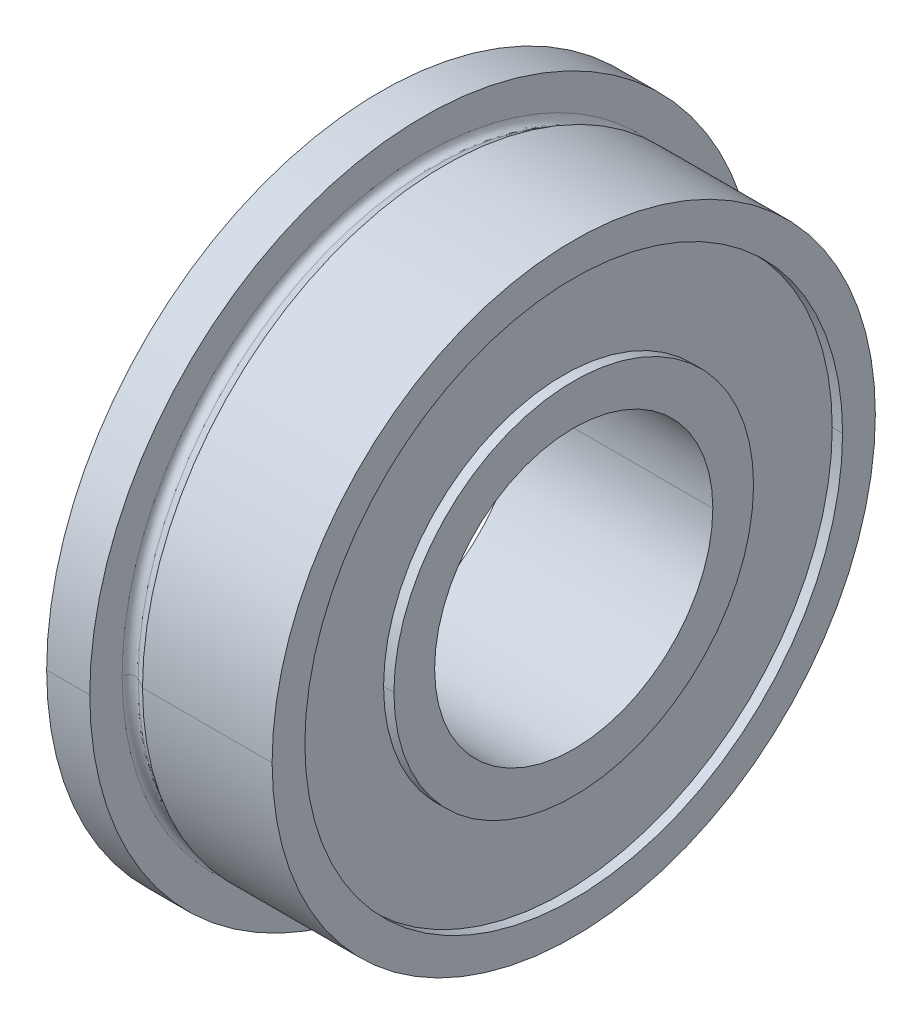
ISO-10303-21;
HEADER;
FILE_DESCRIPTION(('STEP AP214'),'2;1');
FILE_NAME('part.step','',(''),(''),'','','');
FILE_SCHEMA(('AUTOMOTIVE_DESIGN { 1 0 10303 214 1 1 1 1 }'));
ENDSEC;
DATA;
#1=APPLICATION_CONTEXT('core data for automotive mechanical design processes');
#2=APPLICATION_PROTOCOL_DEFINITION('international standard','automotive_design',2000,#1);
#3=PRODUCT_CONTEXT('',#1,'mechanical');
#4=PRODUCT('Part','Part','',(#3));
#5=PRODUCT_RELATED_PRODUCT_CATEGORY('part','',(#4));
#6=PRODUCT_DEFINITION_FORMATION('','',#4);
#7=PRODUCT_DEFINITION_CONTEXT('part definition',#1,'design');
#8=PRODUCT_DEFINITION('design','',#6,#7);
#9=PRODUCT_DEFINITION_SHAPE('','',#8);
#10=(LENGTH_UNIT() NAMED_UNIT(*) SI_UNIT(.MILLI.,.METRE.));
#11=(NAMED_UNIT(*) PLANE_ANGLE_UNIT() SI_UNIT($,.RADIAN.));
#12=(NAMED_UNIT(*) SI_UNIT($,.STERADIAN.) SOLID_ANGLE_UNIT());
#13=UNCERTAINTY_MEASURE_WITH_UNIT(LENGTH_MEASURE(1.E-05),#10,'distance_accuracy_value','');
#14=(GEOMETRIC_REPRESENTATION_CONTEXT(3) GLOBAL_UNCERTAINTY_ASSIGNED_CONTEXT((#13)) GLOBAL_UNIT_ASSIGNED_CONTEXT((#10,
#11,#12)) REPRESENTATION_CONTEXT('',''));
#15=CARTESIAN_POINT('',(0.,0.,0.));
#16=DIRECTION('',(0.,0.,1.));
#17=DIRECTION('',(1.,0.,0.));
#18=AXIS2_PLACEMENT_3D('',#15,#16,#17);
#19=CARTESIAN_POINT('',(7.112,9.906,0.));
#20=DIRECTION('',(-1.,0.,0.));
#21=DIRECTION('',(0.,0.,1.));
#22=AXIS2_PLACEMENT_3D('',#19,#20,#21);
#23=PLANE('',#22);
#24=CARTESIAN_POINT('',(7.112,0.,0.));
#25=DIRECTION('',(-1.,0.,0.));
#26=DIRECTION('',(0.,0.,1.));
#27=AXIS2_PLACEMENT_3D('',#24,#25,#26);
#28=CIRCLE('',#27,9.906);
#29=CARTESIAN_POINT('',(7.112,0.,9.906));
#30=VERTEX_POINT('',#29);
#31=CARTESIAN_POINT('',(7.112,0.,-9.906));
#32=VERTEX_POINT('',#31);
#33=EDGE_CURVE('E29',#30,#32,#28,.T.);
#34=ORIENTED_EDGE('',*,*,#33,.T.);
#35=CARTESIAN_POINT('',(7.112,0.,0.));
#36=DIRECTION('',(-1.,0.,0.));
#37=DIRECTION('',(0.,0.,1.));
#38=AXIS2_PLACEMENT_3D('',#35,#36,#37);
#39=CIRCLE('',#38,9.906);
#40=EDGE_CURVE('E248',#32,#30,#39,.T.);
#41=ORIENTED_EDGE('',*,*,#40,.T.);
#42=EDGE_LOOP('',(#34,#41));
#43=FACE_BOUND('',#42,.T.);
#44=CARTESIAN_POINT('',(7.112,0.,0.));
#45=DIRECTION('',(-1.,0.,0.));
#46=DIRECTION('',(0.,0.,1.));
#47=AXIS2_PLACEMENT_3D('',#44,#45,#46);
#48=CIRCLE('',#47,11.1125);
#49=CARTESIAN_POINT('',(7.112,0.,11.1125));
#50=VERTEX_POINT('',#49);
#51=CARTESIAN_POINT('',(7.112,0.,-11.1125));
#52=VERTEX_POINT('',#51);
#53=EDGE_CURVE('E312',#50,#52,#48,.T.);
#54=ORIENTED_EDGE('',*,*,#53,.F.);
#55=CARTESIAN_POINT('',(7.112,0.,0.));
#56=DIRECTION('',(-1.,0.,0.));
#57=DIRECTION('',(0.,0.,1.));
#58=AXIS2_PLACEMENT_3D('',#55,#56,#57);
#59=CIRCLE('',#58,11.1125);
#60=EDGE_CURVE('E10',#52,#50,#59,.T.);
#61=ORIENTED_EDGE('',*,*,#60,.F.);
#62=EDGE_LOOP('',(#54,#61));
#63=FACE_BOUND('',#62,.T.);
#64=ADVANCED_FACE('F16',(#43,#63),#23,.F.);
#65=CARTESIAN_POINT('',(0.,0.,0.));
#66=DIRECTION('',(-1.,0.,0.));
#67=DIRECTION('',(0.,0.,1.));
#68=AXIS2_PLACEMENT_3D('',#65,#66,#67);
#69=CYLINDRICAL_SURFACE('',#68,11.1125);
#70=DIRECTION('',(-1.,0.,0.));
#71=VECTOR('',#70,1.);
#72=CARTESIAN_POINT('',(0.,0.,-11.1125));
#73=LINE('',#72,#71);
#74=CARTESIAN_POINT('',(2.3375,0.,-11.1125));
#75=VERTEX_POINT('',#74);
#76=EDGE_CURVE('E219',#52,#75,#73,.T.);
#77=ORIENTED_EDGE('',*,*,#76,.F.);
#78=ORIENTED_EDGE('',*,*,#60,.T.);
#79=DIRECTION('',(-1.,0.,0.));
#80=VECTOR('',#79,1.);
#81=CARTESIAN_POINT('',(0.,0.,11.1125));
#82=LINE('',#81,#80);
#83=CARTESIAN_POINT('',(2.3375,0.,11.1125));
#84=VERTEX_POINT('',#83);
#85=EDGE_CURVE('E213',#50,#84,#82,.T.);
#86=ORIENTED_EDGE('',*,*,#85,.T.);
#87=CARTESIAN_POINT('',(2.3375,0.,0.));
#88=DIRECTION('',(-1.,0.,0.));
#89=DIRECTION('',(0.,0.,-1.));
#90=AXIS2_PLACEMENT_3D('',#87,#88,#89);
#91=CIRCLE('',#90,11.1125);
#92=EDGE_CURVE('E197',#75,#84,#91,.T.);
#93=ORIENTED_EDGE('',*,*,#92,.F.);
#94=EDGE_LOOP('',(#77,#78,#86,#93));
#95=FACE_BOUND('',#94,.T.);
#96=ADVANCED_FACE('F215',(#95),#69,.T.);
#97=CARTESIAN_POINT('',(0.,0.,0.));
#98=DIRECTION('',(-1.,0.,0.));
#99=DIRECTION('',(0.,0.,1.));
#100=AXIS2_PLACEMENT_3D('',#97,#98,#99);
#101=CYLINDRICAL_SURFACE('',#100,9.906);
#102=DIRECTION('',(-1.,0.,0.));
#103=VECTOR('',#102,1.);
#104=CARTESIAN_POINT('',(0.,0.,-9.906));
#105=LINE('',#104,#103);
#106=CARTESIAN_POINT('',(6.731,0.,-9.906));
#107=VERTEX_POINT('',#106);
#108=EDGE_CURVE('E252',#32,#107,#105,.T.);
#109=ORIENTED_EDGE('',*,*,#108,.F.);
#110=ORIENTED_EDGE('',*,*,#33,.F.);
#111=DIRECTION('',(-1.,0.,0.));
#112=VECTOR('',#111,1.);
#113=CARTESIAN_POINT('',(0.,0.,9.906));
#114=LINE('',#113,#112);
#115=CARTESIAN_POINT('',(6.731,0.,9.906));
#116=VERTEX_POINT('',#115);
#117=EDGE_CURVE('E305',#30,#116,#114,.T.);
#118=ORIENTED_EDGE('',*,*,#117,.T.);
#119=CARTESIAN_POINT('',(6.731,0.,0.));
#120=DIRECTION('',(-1.,0.,0.));
#121=DIRECTION('',(0.,0.,1.));
#122=AXIS2_PLACEMENT_3D('',#119,#120,#121);
#123=CIRCLE('',#122,9.906);
#124=EDGE_CURVE('E210',#116,#107,#123,.T.);
#125=ORIENTED_EDGE('',*,*,#124,.T.);
#126=EDGE_LOOP('',(#109,#110,#118,#125));
#127=FACE_BOUND('',#126,.T.);
#128=ADVANCED_FACE('F18',(#127),#101,.F.);
#129=CARTESIAN_POINT('',(2.3375,0.,0.));
#130=DIRECTION('',(1.,0.,0.));
#131=DIRECTION('',(0.,0.,-1.));
#132=AXIS2_PLACEMENT_3D('',#129,#130,#131);
#133=CONICAL_SURFACE('',#132,11.1125,0.5235987755983);
#134=DIRECTION('',(0.866025403784437,0.,0.5));
#135=VECTOR('',#134,1.);
#136=CARTESIAN_POINT('',(2.3375,0.,11.1125));
#137=LINE('',#136,#135);
#138=CARTESIAN_POINT('',(1.9625,0.,10.8959936490539));
#139=VERTEX_POINT('',#138);
#140=EDGE_CURVE('E202',#139,#84,#137,.T.);
#141=ORIENTED_EDGE('',*,*,#140,.F.);
#142=CARTESIAN_POINT('',(1.9625,0.,0.));
#143=DIRECTION('',(1.,0.,0.));
#144=DIRECTION('',(0.,0.,1.));
#145=AXIS2_PLACEMENT_3D('',#142,#143,#144);
#146=CIRCLE('',#145,10.8959936490539);
#147=CARTESIAN_POINT('',(1.9625,0.,-10.8959936490539));
#148=VERTEX_POINT('',#147);
#149=EDGE_CURVE('E279',#139,#148,#146,.T.);
#150=ORIENTED_EDGE('',*,*,#149,.T.);
#151=DIRECTION('',(0.866025403784437,0.,-0.5));
#152=VECTOR('',#151,1.);
#153=CARTESIAN_POINT('',(2.3375,0.,-11.1125));
#154=LINE('',#153,#152);
#155=EDGE_CURVE('E205',#148,#75,#154,.T.);
#156=ORIENTED_EDGE('',*,*,#155,.T.);
#157=ORIENTED_EDGE('',*,*,#92,.T.);
#158=EDGE_LOOP('',(#141,#150,#156,#157));
#159=FACE_BOUND('',#158,.T.);
#160=ADVANCED_FACE('F199',(#159),#133,.T.);
#161=CARTESIAN_POINT('',(6.731,9.906,0.));
#162=DIRECTION('',(-1.,0.,0.));
#163=DIRECTION('',(0.,0.,1.));
#164=AXIS2_PLACEMENT_3D('',#161,#162,#163);
#165=PLANE('',#164);
#166=CARTESIAN_POINT('',(6.731,0.,0.));
#167=DIRECTION('',(1.,0.,0.));
#168=DIRECTION('',(0.,0.,1.));
#169=AXIS2_PLACEMENT_3D('',#166,#167,#168);
#170=CIRCLE('',#169,6.625);
#171=CARTESIAN_POINT('',(6.731,0.,6.625));
#172=VERTEX_POINT('',#171);
#173=CARTESIAN_POINT('',(6.731,0.,-6.625));
#174=VERTEX_POINT('',#173);
#175=EDGE_CURVE('E289',#172,#174,#170,.T.);
#176=ORIENTED_EDGE('',*,*,#175,.F.);
#177=CARTESIAN_POINT('',(6.731,0.,0.));
#178=DIRECTION('',(1.,0.,0.));
#179=DIRECTION('',(0.,0.,1.));
#180=AXIS2_PLACEMENT_3D('',#177,#178,#179);
#181=CIRCLE('',#180,6.625);
#182=EDGE_CURVE('E238',#174,#172,#181,.T.);
#183=ORIENTED_EDGE('',*,*,#182,.F.);
#184=EDGE_LOOP('',(#176,#183));
#185=FACE_BOUND('',#184,.T.);
#186=ORIENTED_EDGE('',*,*,#124,.F.);
#187=CARTESIAN_POINT('',(6.731,0.,0.));
#188=DIRECTION('',(-1.,0.,0.));
#189=DIRECTION('',(0.,0.,1.));
#190=AXIS2_PLACEMENT_3D('',#187,#188,#189);
#191=CIRCLE('',#190,9.906);
#192=EDGE_CURVE('E301',#107,#116,#191,.T.);
#193=ORIENTED_EDGE('',*,*,#192,.F.);
#194=EDGE_LOOP('',(#186,#193));
#195=FACE_BOUND('',#194,.T.);
#196=ADVANCED_FACE('F367',(#185,#195),#165,.F.);
#197=CARTESIAN_POINT('',(0.,0.,0.));
#198=DIRECTION('',(-1.,0.,0.));
#199=DIRECTION('',(0.,0.,1.));
#200=AXIS2_PLACEMENT_3D('',#197,#198,#199);
#201=CYLINDRICAL_SURFACE('',#200,6.625);
#202=DIRECTION('',(-1.,0.,0.));
#203=VECTOR('',#202,1.);
#204=CARTESIAN_POINT('',(0.,0.,-6.625));
#205=LINE('',#204,#203);
#206=CARTESIAN_POINT('',(7.112,0.,-6.625));
#207=VERTEX_POINT('',#206);
#208=EDGE_CURVE('E293',#207,#174,#205,.T.);
#209=ORIENTED_EDGE('',*,*,#208,.F.);
#210=CARTESIAN_POINT('',(7.112,0.,0.));
#211=DIRECTION('',(-1.,0.,0.));
#212=DIRECTION('',(0.,0.,1.));
#213=AXIS2_PLACEMENT_3D('',#210,#211,#212);
#214=CIRCLE('',#213,6.625);
#215=CARTESIAN_POINT('',(7.112,0.,6.625));
#216=VERTEX_POINT('',#215);
#217=EDGE_CURVE('E276',#207,#216,#214,.T.);
#218=ORIENTED_EDGE('',*,*,#217,.T.);
#219=DIRECTION('',(-1.,0.,0.));
#220=VECTOR('',#219,1.);
#221=CARTESIAN_POINT('',(0.,0.,6.625));
#222=LINE('',#221,#220);
#223=EDGE_CURVE('E231',#216,#172,#222,.T.);
#224=ORIENTED_EDGE('',*,*,#223,.T.);
#225=ORIENTED_EDGE('',*,*,#175,.T.);
#226=EDGE_LOOP('',(#209,#218,#224,#225));
#227=FACE_BOUND('',#226,.T.);
#228=ADVANCED_FACE('F363',(#227),#201,.T.);
#229=CARTESIAN_POINT('',(1.9625,0.,-10.8959936490539));
#230=CARTESIAN_POINT('',(1.9625,-21.7919872981078,-10.8959936490539));
#231=CARTESIAN_POINT('',(1.9625,-21.7919872981078,10.8959936490539));
#232=CARTESIAN_POINT('',(1.9625,0.,10.8959936490539));
#233=CARTESIAN_POINT('',(1.775,0.,-10.7877404735808));
#234=CARTESIAN_POINT('',(1.775,-21.5754809471617,-10.7877404735808));
#235=CARTESIAN_POINT('',(1.775,-21.5754809471617,10.7877404735808));
#236=CARTESIAN_POINT('',(1.775,0.,10.7877404735808));
#237=CARTESIAN_POINT('',(1.5875,0.,-10.8959936490539));
#238=CARTESIAN_POINT('',(1.5875,-21.7919872981078,-10.8959936490539));
#239=CARTESIAN_POINT('',(1.5875,-21.7919872981078,10.8959936490539));
#240=CARTESIAN_POINT('',(1.5875,0.,10.8959936490539));
#241=CARTESIAN_POINT('',(1.5875,0.,-11.1125));
#242=CARTESIAN_POINT('',(1.5875,-22.225,-11.1125));
#243=CARTESIAN_POINT('',(1.5875,-22.225,11.1125));
#244=CARTESIAN_POINT('',(1.5875,0.,11.1125));
#245=(BOUNDED_SURFACE() B_SPLINE_SURFACE(3,3,((#229,#230,#231,#232),(#233,#234,#235,#236),(#237,
#238,#239,#240),(#241,#242,#243,#244)),.UNSPECIFIED.,.F.,.F.,
.F.) B_SPLINE_SURFACE_WITH_KNOTS((4,4),(4,4),(0.,1.),(0.,1.),
.UNSPECIFIED.) GEOMETRIC_REPRESENTATION_ITEM() RATIONAL_B_SPLINE_SURFACE(((1.,0.333333333333334,
0.333333333333334,1.),(0.666666666666667,0.222222222222222,0.222222222222222,0.666666666666667),
(0.666666666666667,0.222222222222222,0.222222222222222,0.666666666666667),(1.,0.333333333333334,
0.333333333333334,1.))) REPRESENTATION_ITEM('') SURFACE());
#246=CARTESIAN_POINT('',(1.8375,0.,-11.1125));
#247=DIRECTION('',(0.,-1.,0.));
#248=DIRECTION('',(0.,0.,-1.));
#249=AXIS2_PLACEMENT_3D('',#246,#247,#248);
#250=CIRCLE('',#249,0.25);
#251=CARTESIAN_POINT('',(1.5875,0.,-11.1125));
#252=VERTEX_POINT('',#251);
#253=EDGE_CURVE('E440',#148,#252,#250,.T.);
#254=CARTESIAN_POINT('',(1.8375,0.,11.1125));
#255=DIRECTION('',(0.,1.,0.));
#256=DIRECTION('',(0.,0.,1.));
#257=AXIS2_PLACEMENT_3D('',#254,#255,#256);
#258=CIRCLE('',#257,0.25);
#259=CARTESIAN_POINT('',(1.5875,0.,11.1125));
#260=VERTEX_POINT('',#259);
#261=EDGE_CURVE('E294',#139,#260,#258,.T.);
#262=CARTESIAN_POINT('',(1.5875,0.,11.1125));
#263=CARTESIAN_POINT('',(1.5875,-22.225,11.1125));
#264=CARTESIAN_POINT('',(1.5875,-22.225,-11.1125));
#265=CARTESIAN_POINT('',(1.5875,0.,-11.1125));
#266=(BOUNDED_CURVE() B_SPLINE_CURVE(3,(#262,#263,#264,#265),.UNSPECIFIED.,.F.,
.F.) B_SPLINE_CURVE_WITH_KNOTS((4,4),(0.,1.),
.UNSPECIFIED.) CURVE() GEOMETRIC_REPRESENTATION_ITEM() RATIONAL_B_SPLINE_CURVE((1.,
0.333333333333334,0.333333333333334,1.)) REPRESENTATION_ITEM(''));
#267=EDGE_CURVE('E183',#260,#252,#266,.T.);
#268=ORIENTED_EDGE('',*,*,#253,.F.);
#269=ORIENTED_EDGE('',*,*,#149,.F.);
#270=ORIENTED_EDGE('',*,*,#261,.T.);
#271=ORIENTED_EDGE('',*,*,#267,.T.);
#272=EDGE_LOOP('',(#268,#269,#270,#271));
#273=FACE_BOUND('',#272,.T.);
#274=ADVANCED_FACE('F366',(#273),#245,.F.);
#275=CARTESIAN_POINT('',(7.112,5.125,0.));
#276=DIRECTION('',(-1.,0.,0.));
#277=DIRECTION('',(0.,0.,1.));
#278=AXIS2_PLACEMENT_3D('',#275,#276,#277);
#279=PLANE('',#278);
#280=CARTESIAN_POINT('',(7.112,0.,0.));
#281=DIRECTION('',(-1.,0.,0.));
#282=DIRECTION('',(0.,0.,1.));
#283=AXIS2_PLACEMENT_3D('',#280,#281,#282);
#284=CIRCLE('',#283,5.125);
#285=CARTESIAN_POINT('',(7.112,0.,5.125));
#286=VERTEX_POINT('',#285);
#287=CARTESIAN_POINT('',(7.112,0.,-5.125));
#288=VERTEX_POINT('',#287);
#289=EDGE_CURVE('E104',#286,#288,#284,.T.);
#290=ORIENTED_EDGE('',*,*,#289,.T.);
#291=CARTESIAN_POINT('',(7.112,0.,0.));
#292=DIRECTION('',(-1.,0.,0.));
#293=DIRECTION('',(0.,0.,1.));
#294=AXIS2_PLACEMENT_3D('',#291,#292,#293);
#295=CIRCLE('',#294,5.125);
#296=EDGE_CURVE('E242',#288,#286,#295,.T.);
#297=ORIENTED_EDGE('',*,*,#296,.T.);
#298=EDGE_LOOP('',(#290,#297));
#299=FACE_BOUND('',#298,.T.);
#300=CARTESIAN_POINT('',(7.112,0.,0.));
#301=DIRECTION('',(-1.,0.,0.));
#302=DIRECTION('',(0.,0.,1.));
#303=AXIS2_PLACEMENT_3D('',#300,#301,#302);
#304=CIRCLE('',#303,6.625);
#305=EDGE_CURVE('E463',#216,#207,#304,.T.);
#306=ORIENTED_EDGE('',*,*,#305,.F.);
#307=ORIENTED_EDGE('',*,*,#217,.F.);
#308=EDGE_LOOP('',(#306,#307));
#309=FACE_BOUND('',#308,.T.);
#310=ADVANCED_FACE('F389',(#299,#309),#279,.F.);
#311=CARTESIAN_POINT('',(1.5875,11.1125,0.));
#312=DIRECTION('',(-1.,0.,0.));
#313=DIRECTION('',(0.,0.,1.));
#314=AXIS2_PLACEMENT_3D('',#311,#312,#313);
#315=PLANE('',#314);
#316=ORIENTED_EDGE('',*,*,#267,.F.);
#317=CARTESIAN_POINT('',(1.5875,0.,-11.1125));
#318=CARTESIAN_POINT('',(1.5875,22.225,-11.1125));
#319=CARTESIAN_POINT('',(1.5875,22.225,11.1125));
#320=CARTESIAN_POINT('',(1.5875,0.,11.1125));
#321=(BOUNDED_CURVE() B_SPLINE_CURVE(3,(#317,#318,#319,#320),.UNSPECIFIED.,.F.,
.F.) B_SPLINE_CURVE_WITH_KNOTS((4,4),(0.,1.),
.UNSPECIFIED.) CURVE() GEOMETRIC_REPRESENTATION_ITEM() RATIONAL_B_SPLINE_CURVE((1.,
0.333333333333334,0.333333333333334,1.)) REPRESENTATION_ITEM(''));
#322=EDGE_CURVE('E20',#252,#260,#321,.T.);
#323=ORIENTED_EDGE('',*,*,#322,.F.);
#324=EDGE_LOOP('',(#316,#323));
#325=FACE_BOUND('',#324,.T.);
#326=CARTESIAN_POINT('',(1.5875,0.,0.));
#327=DIRECTION('',(-1.,0.,0.));
#328=DIRECTION('',(0.,0.,1.));
#329=AXIS2_PLACEMENT_3D('',#326,#327,#328);
#330=CIRCLE('',#329,12.3063);
#331=CARTESIAN_POINT('',(1.5875,0.,12.3063));
#332=VERTEX_POINT('',#331);
#333=CARTESIAN_POINT('',(1.5875,0.,-12.3063));
#334=VERTEX_POINT('',#333);
#335=EDGE_CURVE('E300',#332,#334,#330,.T.);
#336=ORIENTED_EDGE('',*,*,#335,.F.);
#337=CARTESIAN_POINT('',(1.5875,0.,0.));
#338=DIRECTION('',(-1.,0.,0.));
#339=DIRECTION('',(0.,0.,1.));
#340=AXIS2_PLACEMENT_3D('',#337,#338,#339);
#341=CIRCLE('',#340,12.3063);
#342=EDGE_CURVE('E267',#334,#332,#341,.T.);
#343=ORIENTED_EDGE('',*,*,#342,.F.);
#344=EDGE_LOOP('',(#336,#343));
#345=FACE_BOUND('',#344,.T.);
#346=ADVANCED_FACE('F383',(#325,#345),#315,.F.);
#347=CARTESIAN_POINT('',(0.,0.,0.));
#348=DIRECTION('',(-1.,0.,0.));
#349=DIRECTION('',(0.,0.,1.));
#350=AXIS2_PLACEMENT_3D('',#347,#348,#349);
#351=CYLINDRICAL_SURFACE('',#350,5.125);
#352=DIRECTION('',(-1.,0.,0.));
#353=VECTOR('',#352,1.);
#354=CARTESIAN_POINT('',(0.,0.,-5.125));
#355=LINE('',#354,#353);
#356=CARTESIAN_POINT('',(0.,0.,-5.125));
#357=VERTEX_POINT('',#356);
#358=EDGE_CURVE('E244',#288,#357,#355,.T.);
#359=ORIENTED_EDGE('',*,*,#358,.F.);
#360=ORIENTED_EDGE('',*,*,#289,.F.);
#361=DIRECTION('',(-1.,0.,0.));
#362=VECTOR('',#361,1.);
#363=CARTESIAN_POINT('',(0.,0.,5.125));
#364=LINE('',#363,#362);
#365=CARTESIAN_POINT('',(0.,0.,5.125));
#366=VERTEX_POINT('',#365);
#367=EDGE_CURVE('E450',#286,#366,#364,.T.);
#368=ORIENTED_EDGE('',*,*,#367,.T.);
#369=CARTESIAN_POINT('',(0.,0.,0.));
#370=DIRECTION('',(-1.,0.,0.));
#371=DIRECTION('',(0.,0.,1.));
#372=AXIS2_PLACEMENT_3D('',#369,#370,#371);
#373=CIRCLE('',#372,5.125);
#374=EDGE_CURVE('E270',#366,#357,#373,.T.);
#375=ORIENTED_EDGE('',*,*,#374,.T.);
#376=EDGE_LOOP('',(#359,#360,#368,#375));
#377=FACE_BOUND('',#376,.T.);
#378=ADVANCED_FACE('F339',(#377),#351,.F.);
#379=CARTESIAN_POINT('',(0.,0.,0.));
#380=DIRECTION('',(-1.,0.,0.));
#381=DIRECTION('',(0.,0.,1.));
#382=AXIS2_PLACEMENT_3D('',#379,#380,#381);
#383=CYLINDRICAL_SURFACE('',#382,12.3063);
#384=DIRECTION('',(-1.,0.,0.));
#385=VECTOR('',#384,1.);
#386=CARTESIAN_POINT('',(0.,0.,-12.3063));
#387=LINE('',#386,#385);
#388=CARTESIAN_POINT('',(0.,0.,-12.3063));
#389=VERTEX_POINT('',#388);
#390=EDGE_CURVE('E456',#334,#389,#387,.T.);
#391=ORIENTED_EDGE('',*,*,#390,.F.);
#392=ORIENTED_EDGE('',*,*,#342,.T.);
#393=DIRECTION('',(-1.,0.,0.));
#394=VECTOR('',#393,1.);
#395=CARTESIAN_POINT('',(0.,0.,12.3063));
#396=LINE('',#395,#394);
#397=CARTESIAN_POINT('',(0.,0.,12.3063));
#398=VERTEX_POINT('',#397);
#399=EDGE_CURVE('E245',#332,#398,#396,.T.);
#400=ORIENTED_EDGE('',*,*,#399,.T.);
#401=CARTESIAN_POINT('',(0.,0.,0.));
#402=DIRECTION('',(1.,0.,0.));
#403=DIRECTION('',(0.,0.,1.));
#404=AXIS2_PLACEMENT_3D('',#401,#402,#403);
#405=CIRCLE('',#404,12.3063);
#406=EDGE_CURVE('E117',#398,#389,#405,.T.);
#407=ORIENTED_EDGE('',*,*,#406,.T.);
#408=EDGE_LOOP('',(#391,#392,#400,#407));
#409=FACE_BOUND('',#408,.T.);
#410=ADVANCED_FACE('F335',(#409),#383,.T.);
#411=CARTESIAN_POINT('',(0.,6.625,0.));
#412=DIRECTION('',(1.,0.,0.));
#413=DIRECTION('',(0.,1.,0.));
#414=AXIS2_PLACEMENT_3D('',#411,#412,#413);
#415=PLANE('',#414);
#416=ORIENTED_EDGE('',*,*,#374,.F.);
#417=CARTESIAN_POINT('',(0.,0.,0.));
#418=DIRECTION('',(-1.,0.,0.));
#419=DIRECTION('',(0.,0.,1.));
#420=AXIS2_PLACEMENT_3D('',#417,#418,#419);
#421=CIRCLE('',#420,5.125);
#422=EDGE_CURVE('E263',#357,#366,#421,.T.);
#423=ORIENTED_EDGE('',*,*,#422,.F.);
#424=EDGE_LOOP('',(#416,#423));
#425=FACE_BOUND('',#424,.T.);
#426=CARTESIAN_POINT('',(0.,0.,0.));
#427=DIRECTION('',(1.,0.,0.));
#428=DIRECTION('',(0.,0.,1.));
#429=AXIS2_PLACEMENT_3D('',#426,#427,#428);
#430=CIRCLE('',#429,6.625);
#431=CARTESIAN_POINT('',(0.,0.,6.625));
#432=VERTEX_POINT('',#431);
#433=CARTESIAN_POINT('',(0.,0.,-6.625));
#434=VERTEX_POINT('',#433);
#435=EDGE_CURVE('E259',#432,#434,#430,.T.);
#436=ORIENTED_EDGE('',*,*,#435,.F.);
#437=CARTESIAN_POINT('',(0.,0.,0.));
#438=DIRECTION('',(1.,0.,0.));
#439=DIRECTION('',(0.,0.,1.));
#440=AXIS2_PLACEMENT_3D('',#437,#438,#439);
#441=CIRCLE('',#440,6.625);
#442=EDGE_CURVE('E281',#434,#432,#441,.T.);
#443=ORIENTED_EDGE('',*,*,#442,.F.);
#444=EDGE_LOOP('',(#436,#443));
#445=FACE_BOUND('',#444,.T.);
#446=ADVANCED_FACE('F338',(#425,#445),#415,.F.);
#447=CARTESIAN_POINT('',(0.,12.3063,0.));
#448=DIRECTION('',(1.,0.,0.));
#449=DIRECTION('',(0.,1.,0.));
#450=AXIS2_PLACEMENT_3D('',#447,#448,#449);
#451=PLANE('',#450);
#452=CARTESIAN_POINT('',(0.,0.,0.));
#453=DIRECTION('',(1.,0.,0.));
#454=DIRECTION('',(0.,0.,1.));
#455=AXIS2_PLACEMENT_3D('',#452,#453,#454);
#456=CIRCLE('',#455,9.906);
#457=CARTESIAN_POINT('',(0.,0.,9.906));
#458=VERTEX_POINT('',#457);
#459=CARTESIAN_POINT('',(0.,0.,-9.906));
#460=VERTEX_POINT('',#459);
#461=EDGE_CURVE('E275',#458,#460,#456,.T.);
#462=ORIENTED_EDGE('',*,*,#461,.T.);
#463=CARTESIAN_POINT('',(0.,0.,0.));
#464=DIRECTION('',(1.,0.,0.));
#465=DIRECTION('',(0.,0.,1.));
#466=AXIS2_PLACEMENT_3D('',#463,#464,#465);
#467=CIRCLE('',#466,9.906);
#468=EDGE_CURVE('E152',#460,#458,#467,.T.);
#469=ORIENTED_EDGE('',*,*,#468,.T.);
#470=EDGE_LOOP('',(#462,#469));
#471=FACE_BOUND('',#470,.T.);
#472=ORIENTED_EDGE('',*,*,#406,.F.);
#473=CARTESIAN_POINT('',(0.,0.,0.));
#474=DIRECTION('',(1.,0.,0.));
#475=DIRECTION('',(0.,0.,1.));
#476=AXIS2_PLACEMENT_3D('',#473,#474,#475);
#477=CIRCLE('',#476,12.3063);
#478=EDGE_CURVE('E458',#389,#398,#477,.T.);
#479=ORIENTED_EDGE('',*,*,#478,.F.);
#480=EDGE_LOOP('',(#472,#479));
#481=FACE_BOUND('',#480,.T.);
#482=ADVANCED_FACE('F345',(#471,#481),#451,.F.);
#483=CARTESIAN_POINT('',(0.,0.,0.));
#484=DIRECTION('',(-1.,0.,0.));
#485=DIRECTION('',(0.,0.,1.));
#486=AXIS2_PLACEMENT_3D('',#483,#484,#485);
#487=CYLINDRICAL_SURFACE('',#486,6.625);
#488=DIRECTION('',(-1.,0.,0.));
#489=VECTOR('',#488,1.);
#490=CARTESIAN_POINT('',(0.,0.,-6.625));
#491=LINE('',#490,#489);
#492=CARTESIAN_POINT('',(0.381,0.,-6.625));
#493=VERTEX_POINT('',#492);
#494=EDGE_CURVE('E286',#493,#434,#491,.T.);
#495=ORIENTED_EDGE('',*,*,#494,.F.);
#496=CARTESIAN_POINT('',(0.381,0.,0.));
#497=DIRECTION('',(-1.,0.,0.));
#498=DIRECTION('',(0.,0.,1.));
#499=AXIS2_PLACEMENT_3D('',#496,#497,#498);
#500=CIRCLE('',#499,6.625);
#501=CARTESIAN_POINT('',(0.381,0.,6.625));
#502=VERTEX_POINT('',#501);
#503=EDGE_CURVE('E138',#493,#502,#500,.T.);
#504=ORIENTED_EDGE('',*,*,#503,.T.);
#505=DIRECTION('',(-1.,0.,0.));
#506=VECTOR('',#505,1.);
#507=CARTESIAN_POINT('',(0.,0.,6.625));
#508=LINE('',#507,#506);
#509=EDGE_CURVE('E285',#502,#432,#508,.T.);
#510=ORIENTED_EDGE('',*,*,#509,.T.);
#511=ORIENTED_EDGE('',*,*,#435,.T.);
#512=EDGE_LOOP('',(#495,#504,#510,#511));
#513=FACE_BOUND('',#512,.T.);
#514=ADVANCED_FACE('F341',(#513),#487,.T.);
#515=CARTESIAN_POINT('',(0.,0.,0.));
#516=DIRECTION('',(-1.,0.,0.));
#517=DIRECTION('',(0.,0.,1.));
#518=AXIS2_PLACEMENT_3D('',#515,#516,#517);
#519=CYLINDRICAL_SURFACE('',#518,9.906);
#520=DIRECTION('',(-1.,0.,0.));
#521=VECTOR('',#520,1.);
#522=CARTESIAN_POINT('',(0.,0.,-9.906));
#523=LINE('',#522,#521);
#524=CARTESIAN_POINT('',(0.381,0.,-9.906));
#525=VERTEX_POINT('',#524);
#526=EDGE_CURVE('E443',#525,#460,#523,.T.);
#527=ORIENTED_EDGE('',*,*,#526,.F.);
#528=CARTESIAN_POINT('',(0.381,0.,0.));
#529=DIRECTION('',(1.,0.,0.));
#530=DIRECTION('',(0.,0.,1.));
#531=AXIS2_PLACEMENT_3D('',#528,#529,#530);
#532=CIRCLE('',#531,9.906);
#533=CARTESIAN_POINT('',(0.381,0.,9.906));
#534=VERTEX_POINT('',#533);
#535=EDGE_CURVE('E173',#525,#534,#532,.T.);
#536=ORIENTED_EDGE('',*,*,#535,.T.);
#537=DIRECTION('',(-1.,0.,0.));
#538=VECTOR('',#537,1.);
#539=CARTESIAN_POINT('',(0.,0.,9.906));
#540=LINE('',#539,#538);
#541=EDGE_CURVE('E271',#534,#458,#540,.T.);
#542=ORIENTED_EDGE('',*,*,#541,.T.);
#543=ORIENTED_EDGE('',*,*,#468,.F.);
#544=EDGE_LOOP('',(#527,#536,#542,#543));
#545=FACE_BOUND('',#544,.T.);
#546=ADVANCED_FACE('F344',(#545),#519,.F.);
#547=CARTESIAN_POINT('',(0.381,9.906,0.));
#548=DIRECTION('',(1.,0.,0.));
#549=DIRECTION('',(0.,1.,0.));
#550=AXIS2_PLACEMENT_3D('',#547,#548,#549);
#551=PLANE('',#550);
#552=CARTESIAN_POINT('',(0.381,0.,0.));
#553=DIRECTION('',(-1.,0.,0.));
#554=DIRECTION('',(0.,0.,1.));
#555=AXIS2_PLACEMENT_3D('',#552,#553,#554);
#556=CIRCLE('',#555,6.625);
#557=EDGE_CURVE('E274',#502,#493,#556,.T.);
#558=ORIENTED_EDGE('',*,*,#557,.F.);
#559=ORIENTED_EDGE('',*,*,#503,.F.);
#560=EDGE_LOOP('',(#558,#559));
#561=FACE_BOUND('',#560,.T.);
#562=CARTESIAN_POINT('',(0.381,0.,0.));
#563=DIRECTION('',(1.,0.,0.));
#564=DIRECTION('',(0.,0.,1.));
#565=AXIS2_PLACEMENT_3D('',#562,#563,#564);
#566=CIRCLE('',#565,9.906);
#567=EDGE_CURVE('E297',#534,#525,#566,.T.);
#568=ORIENTED_EDGE('',*,*,#567,.F.);
#569=ORIENTED_EDGE('',*,*,#535,.F.);
#570=EDGE_LOOP('',(#568,#569));
#571=FACE_BOUND('',#570,.T.);
#572=ADVANCED_FACE('F374',(#561,#571),#551,.F.);
#573=CARTESIAN_POINT('',(0.,0.,0.));
#574=DIRECTION('',(-1.,0.,0.));
#575=DIRECTION('',(0.,0.,1.));
#576=AXIS2_PLACEMENT_3D('',#573,#574,#575);
#577=CYLINDRICAL_SURFACE('',#576,11.1125);
#578=ORIENTED_EDGE('',*,*,#53,.T.);
#579=ORIENTED_EDGE('',*,*,#76,.T.);
#580=CARTESIAN_POINT('',(2.3375,0.,0.));
#581=DIRECTION('',(-1.,0.,0.));
#582=DIRECTION('',(0.,0.,-1.));
#583=AXIS2_PLACEMENT_3D('',#580,#581,#582);
#584=CIRCLE('',#583,11.1125);
#585=EDGE_CURVE('E221',#84,#75,#584,.T.);
#586=ORIENTED_EDGE('',*,*,#585,.F.);
#587=ORIENTED_EDGE('',*,*,#85,.F.);
#588=EDGE_LOOP('',(#578,#579,#586,#587));
#589=FACE_BOUND('',#588,.T.);
#590=ADVANCED_FACE('F222',(#589),#577,.T.);
#591=CARTESIAN_POINT('',(0.,0.,0.));
#592=DIRECTION('',(-1.,0.,0.));
#593=DIRECTION('',(0.,0.,1.));
#594=AXIS2_PLACEMENT_3D('',#591,#592,#593);
#595=CYLINDRICAL_SURFACE('',#594,9.906);
#596=ORIENTED_EDGE('',*,*,#40,.F.);
#597=ORIENTED_EDGE('',*,*,#108,.T.);
#598=ORIENTED_EDGE('',*,*,#192,.T.);
#599=ORIENTED_EDGE('',*,*,#117,.F.);
#600=EDGE_LOOP('',(#596,#597,#598,#599));
#601=FACE_BOUND('',#600,.T.);
#602=ADVANCED_FACE('F357',(#601),#595,.F.);
#603=CARTESIAN_POINT('',(2.3375,0.,0.));
#604=DIRECTION('',(1.,0.,0.));
#605=DIRECTION('',(0.,0.,-1.));
#606=AXIS2_PLACEMENT_3D('',#603,#604,#605);
#607=CONICAL_SURFACE('',#606,11.1125,0.5235987755983);
#608=CARTESIAN_POINT('',(1.9625,0.,0.));
#609=DIRECTION('',(1.,0.,0.));
#610=DIRECTION('',(0.,0.,1.));
#611=AXIS2_PLACEMENT_3D('',#608,#609,#610);
#612=CIRCLE('',#611,10.8959936490539);
#613=EDGE_CURVE('E229',#148,#139,#612,.T.);
#614=ORIENTED_EDGE('',*,*,#613,.T.);
#615=ORIENTED_EDGE('',*,*,#140,.T.);
#616=ORIENTED_EDGE('',*,*,#585,.T.);
#617=ORIENTED_EDGE('',*,*,#155,.F.);
#618=EDGE_LOOP('',(#614,#615,#616,#617));
#619=FACE_BOUND('',#618,.T.);
#620=ADVANCED_FACE('F227',(#619),#607,.T.);
#621=CARTESIAN_POINT('',(0.,0.,0.));
#622=DIRECTION('',(-1.,0.,0.));
#623=DIRECTION('',(0.,0.,1.));
#624=AXIS2_PLACEMENT_3D('',#621,#622,#623);
#625=CYLINDRICAL_SURFACE('',#624,6.625);
#626=ORIENTED_EDGE('',*,*,#305,.T.);
#627=ORIENTED_EDGE('',*,*,#208,.T.);
#628=ORIENTED_EDGE('',*,*,#182,.T.);
#629=ORIENTED_EDGE('',*,*,#223,.F.);
#630=EDGE_LOOP('',(#626,#627,#628,#629));
#631=FACE_BOUND('',#630,.T.);
#632=ADVANCED_FACE('F355',(#631),#625,.T.);
#633=CARTESIAN_POINT('',(0.,0.,0.));
#634=DIRECTION('',(-1.,0.,0.));
#635=DIRECTION('',(0.,0.,1.));
#636=AXIS2_PLACEMENT_3D('',#633,#634,#635);
#637=CYLINDRICAL_SURFACE('',#636,5.125);
#638=ORIENTED_EDGE('',*,*,#296,.F.);
#639=ORIENTED_EDGE('',*,*,#358,.T.);
#640=ORIENTED_EDGE('',*,*,#422,.T.);
#641=ORIENTED_EDGE('',*,*,#367,.F.);
#642=EDGE_LOOP('',(#638,#639,#640,#641));
#643=FACE_BOUND('',#642,.T.);
#644=ADVANCED_FACE('F352',(#643),#637,.F.);
#645=CARTESIAN_POINT('',(0.,0.,0.));
#646=DIRECTION('',(-1.,0.,0.));
#647=DIRECTION('',(0.,0.,1.));
#648=AXIS2_PLACEMENT_3D('',#645,#646,#647);
#649=CYLINDRICAL_SURFACE('',#648,12.3063);
#650=ORIENTED_EDGE('',*,*,#335,.T.);
#651=ORIENTED_EDGE('',*,*,#390,.T.);
#652=ORIENTED_EDGE('',*,*,#478,.T.);
#653=ORIENTED_EDGE('',*,*,#399,.F.);
#654=EDGE_LOOP('',(#650,#651,#652,#653));
#655=FACE_BOUND('',#654,.T.);
#656=ADVANCED_FACE('F350',(#655),#649,.T.);
#657=CARTESIAN_POINT('',(0.,0.,0.));
#658=DIRECTION('',(-1.,0.,0.));
#659=DIRECTION('',(0.,0.,1.));
#660=AXIS2_PLACEMENT_3D('',#657,#658,#659);
#661=CYLINDRICAL_SURFACE('',#660,6.625);
#662=ORIENTED_EDGE('',*,*,#557,.T.);
#663=ORIENTED_EDGE('',*,*,#494,.T.);
#664=ORIENTED_EDGE('',*,*,#442,.T.);
#665=ORIENTED_EDGE('',*,*,#509,.F.);
#666=EDGE_LOOP('',(#662,#663,#664,#665));
#667=FACE_BOUND('',#666,.T.);
#668=ADVANCED_FACE('F346',(#667),#661,.T.);
#669=CARTESIAN_POINT('',(0.,0.,0.));
#670=DIRECTION('',(-1.,0.,0.));
#671=DIRECTION('',(0.,0.,1.));
#672=AXIS2_PLACEMENT_3D('',#669,#670,#671);
#673=CYLINDRICAL_SURFACE('',#672,9.906);
#674=ORIENTED_EDGE('',*,*,#567,.T.);
#675=ORIENTED_EDGE('',*,*,#526,.T.);
#676=ORIENTED_EDGE('',*,*,#461,.F.);
#677=ORIENTED_EDGE('',*,*,#541,.F.);
#678=EDGE_LOOP('',(#674,#675,#676,#677));
#679=FACE_BOUND('',#678,.T.);
#680=ADVANCED_FACE('F349',(#679),#673,.F.);
#681=CARTESIAN_POINT('',(1.9625,0.,10.8959936490539));
#682=CARTESIAN_POINT('',(1.9625,21.7919872981078,10.8959936490539));
#683=CARTESIAN_POINT('',(1.9625,21.7919872981078,-10.8959936490539));
#684=CARTESIAN_POINT('',(1.9625,0.,-10.8959936490539));
#685=CARTESIAN_POINT('',(1.775,0.,10.7877404735808));
#686=CARTESIAN_POINT('',(1.775,21.5754809471617,10.7877404735808));
#687=CARTESIAN_POINT('',(1.775,21.5754809471617,-10.7877404735808));
#688=CARTESIAN_POINT('',(1.775,0.,-10.7877404735808));
#689=CARTESIAN_POINT('',(1.5875,0.,10.8959936490539));
#690=CARTESIAN_POINT('',(1.5875,21.7919872981078,10.8959936490539));
#691=CARTESIAN_POINT('',(1.5875,21.7919872981078,-10.8959936490539));
#692=CARTESIAN_POINT('',(1.5875,0.,-10.8959936490539));
#693=CARTESIAN_POINT('',(1.5875,0.,11.1125));
#694=CARTESIAN_POINT('',(1.5875,22.225,11.1125));
#695=CARTESIAN_POINT('',(1.5875,22.225,-11.1125));
#696=CARTESIAN_POINT('',(1.5875,0.,-11.1125));
#697=(BOUNDED_SURFACE() B_SPLINE_SURFACE(3,3,((#681,#682,#683,#684),(#685,#686,#687,#688),(#689,
#690,#691,#692),(#693,#694,#695,#696)),.UNSPECIFIED.,.F.,.F.,
.F.) B_SPLINE_SURFACE_WITH_KNOTS((4,4),(4,4),(0.,1.),(0.,1.),
.UNSPECIFIED.) GEOMETRIC_REPRESENTATION_ITEM() RATIONAL_B_SPLINE_SURFACE(((1.,0.333333333333334,
0.333333333333334,1.),(0.666666666666667,0.222222222222222,0.222222222222222,0.666666666666667),
(0.666666666666667,0.222222222222222,0.222222222222222,0.666666666666667),(1.,0.333333333333334,
0.333333333333334,1.))) REPRESENTATION_ITEM('') SURFACE());
#698=ORIENTED_EDGE('',*,*,#613,.F.);
#699=ORIENTED_EDGE('',*,*,#253,.T.);
#700=ORIENTED_EDGE('',*,*,#322,.T.);
#701=ORIENTED_EDGE('',*,*,#261,.F.);
#702=EDGE_LOOP('',(#698,#699,#700,#701));
#703=FACE_BOUND('',#702,.T.);
#704=ADVANCED_FACE('F403',(#703),#697,.F.);
#705=CLOSED_SHELL('',(#64,#96,#128,#160,#196,#228,#274,#310,#346,#378,#410,#446,#482,#514,#546,
#572,#590,#602,#620,#632,#644,#656,#668,#680,#704));
#706=MANIFOLD_SOLID_BREP('B1',#705);
#707=ADVANCED_BREP_SHAPE_REPRESENTATION('',(#18,#706),#14);
#708=SHAPE_DEFINITION_REPRESENTATION(#9,#707);
ENDSEC;
END-ISO-10303-21;
